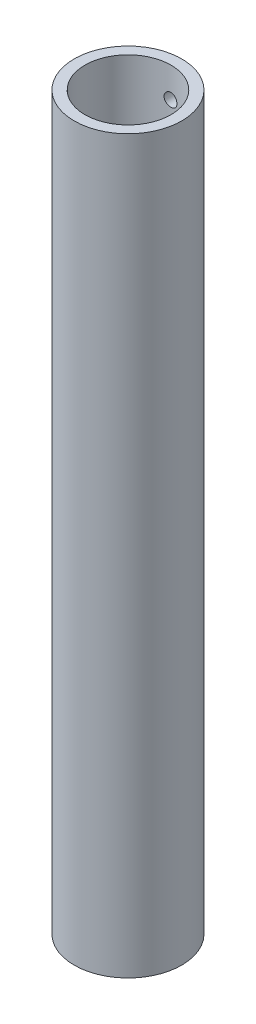
ISO-10303-21;
HEADER;
FILE_DESCRIPTION(('STEP AP214'),'2;1');
FILE_NAME('part.step','',(''),(''),'','','');
FILE_SCHEMA(('AUTOMOTIVE_DESIGN { 1 0 10303 214 1 1 1 1 }'));
ENDSEC;
DATA;
#1=APPLICATION_CONTEXT('core data for automotive mechanical design processes');
#2=APPLICATION_PROTOCOL_DEFINITION('international standard','automotive_design',2000,#1);
#3=PRODUCT_CONTEXT('',#1,'mechanical');
#4=PRODUCT('Part','Part','',(#3));
#5=PRODUCT_RELATED_PRODUCT_CATEGORY('part','',(#4));
#6=PRODUCT_DEFINITION_FORMATION('','',#4);
#7=PRODUCT_DEFINITION_CONTEXT('part definition',#1,'design');
#8=PRODUCT_DEFINITION('design','',#6,#7);
#9=PRODUCT_DEFINITION_SHAPE('','',#8);
#10=(LENGTH_UNIT() NAMED_UNIT(*) SI_UNIT(.MILLI.,.METRE.));
#11=(NAMED_UNIT(*) PLANE_ANGLE_UNIT() SI_UNIT($,.RADIAN.));
#12=(NAMED_UNIT(*) SI_UNIT($,.STERADIAN.) SOLID_ANGLE_UNIT());
#13=UNCERTAINTY_MEASURE_WITH_UNIT(LENGTH_MEASURE(1.E-05),#10,'distance_accuracy_value','');
#14=(GEOMETRIC_REPRESENTATION_CONTEXT(3) GLOBAL_UNCERTAINTY_ASSIGNED_CONTEXT((#13)) GLOBAL_UNIT_ASSIGNED_CONTEXT((#10,
#11,#12)) REPRESENTATION_CONTEXT('',''));
#15=CARTESIAN_POINT('',(0.,0.,0.));
#16=DIRECTION('',(0.,0.,1.));
#17=DIRECTION('',(1.,0.,0.));
#18=AXIS2_PLACEMENT_3D('',#15,#16,#17);
#19=CARTESIAN_POINT('',(0.,170.,0.));
#20=DIRECTION('',(0.,1.,0.));
#21=DIRECTION('',(0.,0.,1.));
#22=AXIS2_PLACEMENT_3D('',#19,#20,#21);
#23=PLANE('',#22);
#24=CARTESIAN_POINT('',(0.,170.,0.));
#25=DIRECTION('',(0.,1.,0.));
#26=DIRECTION('',(0.,0.,1.));
#27=AXIS2_PLACEMENT_3D('',#24,#25,#26);
#28=CIRCLE('',#27,12.5);
#29=CARTESIAN_POINT('',(0.,170.,12.5));
#30=VERTEX_POINT('',#29);
#31=EDGE_CURVE('E10',#30,#30,#28,.T.);
#32=ORIENTED_EDGE('',*,*,#31,.T.);
#33=EDGE_LOOP('',(#32));
#34=FACE_BOUND('',#33,.T.);
#35=CARTESIAN_POINT('',(0.,170.,0.));
#36=DIRECTION('',(0.,1.,0.));
#37=DIRECTION('',(0.,0.,1.));
#38=AXIS2_PLACEMENT_3D('',#35,#36,#37);
#39=CIRCLE('',#38,9.99999999999999);
#40=CARTESIAN_POINT('',(0.,170.,9.99999999999999));
#41=VERTEX_POINT('',#40);
#42=EDGE_CURVE('E57',#41,#41,#39,.T.);
#43=ORIENTED_EDGE('',*,*,#42,.F.);
#44=EDGE_LOOP('',(#43));
#45=FACE_BOUND('',#44,.T.);
#46=ADVANCED_FACE('F38',(#34,#45),#23,.T.);
#47=CARTESIAN_POINT('',(0.,0.,0.));
#48=DIRECTION('',(0.,1.,0.));
#49=DIRECTION('',(0.,0.,1.));
#50=AXIS2_PLACEMENT_3D('',#47,#48,#49);
#51=PLANE('',#50);
#52=CARTESIAN_POINT('',(0.,0.,0.));
#53=DIRECTION('',(0.,1.,0.));
#54=DIRECTION('',(0.,0.,1.));
#55=AXIS2_PLACEMENT_3D('',#52,#53,#54);
#56=CIRCLE('',#55,12.5);
#57=CARTESIAN_POINT('',(0.,0.,12.5));
#58=VERTEX_POINT('',#57);
#59=EDGE_CURVE('E52',#58,#58,#56,.T.);
#60=ORIENTED_EDGE('',*,*,#59,.F.);
#61=EDGE_LOOP('',(#60));
#62=FACE_BOUND('',#61,.T.);
#63=CARTESIAN_POINT('',(0.,0.,0.));
#64=DIRECTION('',(0.,1.,0.));
#65=DIRECTION('',(0.,0.,1.));
#66=AXIS2_PLACEMENT_3D('',#63,#64,#65);
#67=CIRCLE('',#66,9.99999999999999);
#68=CARTESIAN_POINT('',(0.,0.,9.99999999999999));
#69=VERTEX_POINT('',#68);
#70=EDGE_CURVE('E59',#69,#69,#67,.T.);
#71=ORIENTED_EDGE('',*,*,#70,.T.);
#72=EDGE_LOOP('',(#71));
#73=FACE_BOUND('',#72,.T.);
#74=ADVANCED_FACE('F80',(#62,#73),#51,.F.);
#75=CARTESIAN_POINT('',(0.,170.,0.));
#76=DIRECTION('',(0.,-1.,0.));
#77=DIRECTION('',(0.,0.,-1.));
#78=AXIS2_PLACEMENT_3D('',#75,#76,#77);
#79=CYLINDRICAL_SURFACE('',#78,12.5);
#80=CARTESIAN_POINT('',(0.,164.5,-12.5));
#81=CARTESIAN_POINT('',(-0.0839320235538492,164.499996418029,-12.499998867873));
#82=CARTESIAN_POINT('',(-0.167917158665595,164.492931670654,-12.4991457100204));
#83=CARTESIAN_POINT('',(-0.333552285654122,164.464859467922,-12.495824352711));
#84=CARTESIAN_POINT('',(-0.41519971479503,164.443837279375,-12.4933544466864));
#85=CARTESIAN_POINT('',(-0.573737397670255,164.388476861737,-12.4870779632713));
#86=CARTESIAN_POINT('',(-0.650630743796111,164.354147396588,-12.4832722657654));
#87=CARTESIAN_POINT('',(-0.79754957891599,164.273165632458,-12.4747479632173));
#88=CARTESIAN_POINT('',(-0.867576283567572,164.226515520123,-12.4700295202071));
#89=CARTESIAN_POINT('',(-0.999145657672247,164.121962569012,-12.460180052721));
#90=CARTESIAN_POINT('',(-1.06064834565359,164.064009579944,-12.4550472515452));
#91=CARTESIAN_POINT('',(-1.1730796551917,163.938603517556,-12.4449619698576));
#92=CARTESIAN_POINT('',(-1.22400774913236,163.871149970491,-12.4400094983534));
#93=CARTESIAN_POINT('',(-1.31399171436948,163.728399587351,-12.4308280185202));
#94=CARTESIAN_POINT('',(-1.35301037836285,163.65307913771,-12.4266012951986));
#95=CARTESIAN_POINT('',(-1.4178302865078,163.496895648946,-12.4193730672343));
#96=CARTESIAN_POINT('',(-1.44363199348388,163.416032804015,-12.4163715196899));
#97=CARTESIAN_POINT('',(-1.481164650227,163.251473570344,-12.4119503036869));
#98=CARTESIAN_POINT('',(-1.49296288993823,163.167792735786,-12.4105230726271));
#99=CARTESIAN_POINT('',(-1.50236187609835,162.999627531818,-12.4093888845306));
#100=CARTESIAN_POINT('',(-1.49996315026424,162.915143192392,-12.4096818635516));
#101=CARTESIAN_POINT('',(-1.48109158039334,162.748237017608,-12.4119480733153));
#102=CARTESIAN_POINT('',(-1.46469271611152,162.66580668066,-12.4139124717338));
#103=CARTESIAN_POINT('',(-1.41840173085034,162.504876486089,-12.4192864043804));
#104=CARTESIAN_POINT('',(-1.38850935612908,162.42637670241,-12.4226959657844));
#105=CARTESIAN_POINT('',(-1.31599990349931,162.27530526588,-12.4305861039738));
#106=CARTESIAN_POINT('',(-1.27335053101963,162.202749260823,-12.4350693931099));
#107=CARTESIAN_POINT('',(-1.17656086584735,162.065796394542,-12.444599699395));
#108=CARTESIAN_POINT('',(-1.12242008861579,162.001399877549,-12.4496467403106));
#109=CARTESIAN_POINT('',(-1.00377377781091,161.882164457818,-12.4597751654319));
#110=CARTESIAN_POINT('',(-0.939204450256097,161.827389015071,-12.464856563712));
#111=CARTESIAN_POINT('',(-0.801753979469379,161.7294442395,-12.4744510399275));
#112=CARTESIAN_POINT('',(-0.728872819540037,161.68627492999,-12.478964116721));
#113=CARTESIAN_POINT('',(-0.576819654131431,161.61276835718,-12.4869159430851));
#114=CARTESIAN_POINT('',(-0.497645789357803,161.582434903335,-12.4903543736405));
#115=CARTESIAN_POINT('',(-0.335278011136724,161.535510631075,-12.4957665326545));
#116=CARTESIAN_POINT('',(-0.252084271220814,161.518919219998,-12.4977403242792));
#117=CARTESIAN_POINT('',(-0.0845871981871095,161.500031872251,-12.4999926250152));
#118=CARTESIAN_POINT('',(-0.000293860216027687,161.4976484838,-12.5002815046876));
#119=CARTESIAN_POINT('',(0.167491034121627,161.507014288934,-12.4991593911616));
#120=CARTESIAN_POINT('',(0.25098260616366,161.518763205648,-12.4977484312654));
#121=CARTESIAN_POINT('',(0.414537131964172,161.555987482002,-12.4933916690343));
#122=CARTESIAN_POINT('',(0.494609673184511,161.581421306525,-12.4904505118954));
#123=CARTESIAN_POINT('',(0.649352698843224,161.645250351677,-12.4833627750896));
#124=CARTESIAN_POINT('',(0.724023012961732,161.683645980745,-12.4792161574379));
#125=CARTESIAN_POINT('',(0.866233588832516,161.772521457951,-12.4701542579347));
#126=CARTESIAN_POINT('',(0.933738144813748,161.823058068905,-12.4652354042322));
#127=CARTESIAN_POINT('',(1.05933812576101,161.934700423204,-12.455190895971));
#128=CARTESIAN_POINT('',(1.11743320736474,161.995806552074,-12.4500652338742));
#129=CARTESIAN_POINT('',(1.22287397613076,162.127237807714,-12.4401529742471));
#130=CARTESIAN_POINT('',(1.27016181615969,162.197609507672,-12.4353682915654));
#131=CARTESIAN_POINT('',(1.35224657214666,162.345347512538,-12.4267107496692));
#132=CARTESIAN_POINT('',(1.38704372178037,162.422713686559,-12.4228378733971));
#133=CARTESIAN_POINT('',(1.4430649833408,162.582055304447,-12.4164552867251));
#134=CARTESIAN_POINT('',(1.46432210079673,162.66401900593,-12.4139422637816));
#135=CARTESIAN_POINT('',(1.49276636081758,162.830384484743,-12.4105542637293));
#136=CARTESIAN_POINT('',(1.49995410263041,162.914786158079,-12.4096792168553));
#137=CARTESIAN_POINT('',(1.50004516908966,163.083056364819,-12.4096681633035));
#138=CARTESIAN_POINT('',(1.49303936835676,163.166924862886,-12.4105210931972));
#139=CARTESIAN_POINT('',(1.46513424336045,163.332283393197,-12.4138461473713));
#140=CARTESIAN_POINT('',(1.44423491411034,163.413773424588,-12.4163182722328));
#141=CARTESIAN_POINT('',(1.38916369910273,163.572052269444,-12.4225998262293));
#142=CARTESIAN_POINT('',(1.35499582785269,163.648842496748,-12.4264088508406));
#143=CARTESIAN_POINT('',(1.27436641314005,163.795613873535,-12.4349357269569));
#144=CARTESIAN_POINT('',(1.22790476354723,163.86559496423,-12.4396535863076));
#145=CARTESIAN_POINT('',(1.12366844823603,163.997226470054,-12.4495027561294));
#146=CARTESIAN_POINT('',(1.06582601965076,164.058823051633,-12.4546364290673));
#147=CARTESIAN_POINT('',(0.940610466672243,164.171471239783,-12.4647177484085));
#148=CARTESIAN_POINT('',(0.87323509131801,164.222520348815,-12.4696653505255));
#149=CARTESIAN_POINT('',(0.730596612325688,164.312775288999,-12.4788360854662));
#150=CARTESIAN_POINT('',(0.655306617312091,164.351938862861,-12.4830566108105));
#151=CARTESIAN_POINT('',(0.499211375842659,164.417011882221,-12.4902709259863));
#152=CARTESIAN_POINT('',(0.418412282181075,164.44293584809,-12.4932660590308));
#153=CARTESIAN_POINT('',(0.280988550618351,164.474531710169,-12.4969634163));
#154=CARTESIAN_POINT('',(0.225233284876746,164.484068741943,-12.4980966397165));
#155=CARTESIAN_POINT('',(0.112993367846849,164.496804071745,-12.4996153102102));
#156=CARTESIAN_POINT('',(0.0565087213768136,164.500002411625,-12.5000007622246));
#157=CARTESIAN_POINT('',(0.,164.5,-12.5));
#158=B_SPLINE_CURVE_WITH_KNOTS('',3,(#80,#81,#82,#83,#84,#85,#86,#87,#88,#89,#90,#91,#92,#93,
#94,#95,#96,#97,#98,#99,#100,#101,#102,#103,#104,#105,#106,#107,#108,#109,#110,#111,#112,#113,
#114,#115,#116,#117,#118,#119,#120,#121,#122,#123,#124,#125,#126,#127,#128,#129,#130,#131,#132,
#133,#134,#135,#136,#137,#138,#139,#140,#141,#142,#143,#144,#145,#146,#147,#148,#149,#150,#151,
#152,#153,#154,#155,#156,#157),.UNSPECIFIED.,.T.,.F.,(4,2,2,2,2,2,2,2,2,2,2,2,2,2,2,2,2,2,2,2,2,
2,2,2,2,2,2,2,2,2,2,2,2,2,2,2,2,2,4),(0.,0.251589675478076,0.503445347043116,0.755135431877781,
1.00678087720846,1.25956936097938,1.51237045452441,1.765953447482,2.01952755999557,
2.27187819171636,2.52421944334237,2.77523546456125,3.02625620626699,3.27791786855267,
3.52959014434629,3.78286472320156,4.036139810863,4.28949001347139,4.5428292891131,
4.79460761312113,5.04638100450539,5.29739451278873,5.54841593150835,5.8006346089278,
6.05286248801782,6.30641037908359,6.55995352653148,6.81287624132442,7.06578818330769,
7.31708596596143,7.56838383881168,7.81960573856941,8.07082980715607,8.32359762010158,
8.57642521760044,8.83014145119728,9.08357882396373,9.25296714728133,9.42235435219904),.UNSPECIFIED.);
#159=CARTESIAN_POINT('',(0.,164.5,-12.5));
#160=VERTEX_POINT('',#159);
#161=EDGE_CURVE('E62',#160,#160,#158,.T.);
#162=ORIENTED_EDGE('',*,*,#161,.T.);
#163=EDGE_LOOP('',(#162));
#164=FACE_BOUND('',#163,.T.);
#165=ORIENTED_EDGE('',*,*,#31,.F.);
#166=EDGE_LOOP('',(#165));
#167=FACE_BOUND('',#166,.T.);
#168=ORIENTED_EDGE('',*,*,#59,.T.);
#169=EDGE_LOOP('',(#168));
#170=FACE_BOUND('',#169,.T.);
#171=ADVANCED_FACE('F40',(#164,#167,#170),#79,.T.);
#172=CARTESIAN_POINT('',(0.,170.,0.));
#173=DIRECTION('',(0.,-1.,0.));
#174=DIRECTION('',(0.,0.,-1.));
#175=AXIS2_PLACEMENT_3D('',#172,#173,#174);
#176=CYLINDRICAL_SURFACE('',#175,9.99999999999999);
#177=CARTESIAN_POINT('',(0.,164.5,-9.99999999999999));
#178=CARTESIAN_POINT('',(-0.0837515444816415,164.499996546185,-9.99999865771296));
#179=CARTESIAN_POINT('',(-0.16755168508213,164.492961999159,-9.99893682537039));
#180=CARTESIAN_POINT('',(-0.33280962799491,164.465016800017,-9.99480315973186));
#181=CARTESIAN_POINT('',(-0.414265068974225,164.444092637055,-9.99172936938472));
#182=CARTESIAN_POINT('',(-0.572418086221851,164.389007495032,-9.98391721219525));
#183=CARTESIAN_POINT('',(-0.649119207826785,164.354856520494,-9.97918010370919));
#184=CARTESIAN_POINT('',(-0.795690428635238,164.274311620583,-9.96856475911723));
#185=CARTESIAN_POINT('',(-0.865561474725172,164.227919395583,-9.96268668152772));
#186=CARTESIAN_POINT('',(-0.997046719562113,164.12382273506,-9.95039170991452));
#187=CARTESIAN_POINT('',(-1.05859983222549,164.066041543792,-9.94397133890331));
#188=CARTESIAN_POINT('',(-1.17117490668948,163.940972311106,-9.93134261133238));
#189=CARTESIAN_POINT('',(-1.22219626272935,163.873683723221,-9.92513426698504));
#190=CARTESIAN_POINT('',(-1.31249729499942,163.731099356478,-9.91359877458725));
#191=CARTESIAN_POINT('',(-1.35171787037205,163.655765753019,-9.9082761197503));
#192=CARTESIAN_POINT('',(-1.41692632171056,163.499487179355,-9.89916211306267));
#193=CARTESIAN_POINT('',(-1.44291491889163,163.418542515256,-9.89537067775448));
#194=CARTESIAN_POINT('',(-1.48073198798911,163.253981958128,-9.88978256218673));
#195=CARTESIAN_POINT('',(-1.49266503640518,163.170390606592,-9.8879711574125));
#196=CARTESIAN_POINT('',(-1.50235624033932,163.002373834013,-9.88650348970581));
#197=CARTESIAN_POINT('',(-1.50011520973796,162.917948461138,-9.88684710303146));
#198=CARTESIAN_POINT('',(-1.48160733250788,162.751398919806,-9.88963718352409));
#199=CARTESIAN_POINT('',(-1.46545695927751,162.669261473515,-9.89206618761549));
#200=CARTESIAN_POINT('',(-1.41977117403735,162.508875631128,-9.89872608126367));
#201=CARTESIAN_POINT('',(-1.39023538337813,162.430627345119,-9.90295702179379));
#202=CARTESIAN_POINT('',(-1.31849603529736,162.279886628717,-9.9127633554548));
#203=CARTESIAN_POINT('',(-1.27624314283197,162.207418030908,-9.91834396766526));
#204=CARTESIAN_POINT('',(-1.18030413128954,162.070555404218,-9.93021707574547));
#205=CARTESIAN_POINT('',(-1.12661726182478,162.006161905731,-9.936509618325));
#206=CARTESIAN_POINT('',(-1.00869493078248,161.88660233926,-9.94917473056209));
#207=CARTESIAN_POINT('',(-0.944359329641992,161.831535009714,-9.95554747112814));
#208=CARTESIAN_POINT('',(-0.80730708989417,161.732964065493,-9.96759647648461));
#209=CARTESIAN_POINT('',(-0.734590414588157,161.689460501456,-9.9732727382251));
#210=CARTESIAN_POINT('',(-0.582754598213678,161.6152469135,-9.98329515585392));
#211=CARTESIAN_POINT('',(-0.503631677836775,161.58454450816,-9.98764051925427));
#212=CARTESIAN_POINT('',(-0.341273182487061,161.536890610315,-9.99450490557069));
#213=CARTESIAN_POINT('',(-0.258037885952605,161.519938188184,-9.99702405195467));
#214=CARTESIAN_POINT('',(-0.090669567643655,161.500396770183,-9.99993581133871));
#215=CARTESIAN_POINT('',(-0.00655273187047949,161.497672028621,-10.0003485209039));
#216=CARTESIAN_POINT('',(0.160936677662272,161.506303005311,-9.99905561015226));
#217=CARTESIAN_POINT('',(0.244309274381865,161.517658287668,-9.99735005541368));
#218=CARTESIAN_POINT('',(0.4075323874314,161.554014100178,-9.99202468615333));
#219=CARTESIAN_POINT('',(0.487397963079835,161.578948496031,-9.98841415207984));
#220=CARTESIAN_POINT('',(0.641814958642997,161.641684997462,-9.97968235658369));
#221=CARTESIAN_POINT('',(0.716366128795094,161.679487707334,-9.97456102421565));
#222=CARTESIAN_POINT('',(0.858634979291911,161.767206224564,-9.96332682468686));
#223=CARTESIAN_POINT('',(0.926299009891555,161.817208140013,-9.95720701626745));
#224=CARTESIAN_POINT('',(1.0523236731777,161.927785811629,-9.94467863012164));
#225=CARTESIAN_POINT('',(1.11068376479339,161.988362182325,-9.93827003562867));
#226=CARTESIAN_POINT('',(1.21693784957195,162.118973533176,-9.92582264304493));
#227=CARTESIAN_POINT('',(1.26474084747421,162.189082925195,-9.91978736017588));
#228=CARTESIAN_POINT('',(1.34789129270584,162.336416040512,-9.90883219104903));
#229=CARTESIAN_POINT('',(1.38323907656435,162.413639571521,-9.90391227465628));
#230=CARTESIAN_POINT('',(1.44033467323943,162.572737533623,-9.89577033008644));
#231=CARTESIAN_POINT('',(1.46213037141636,162.654594460971,-9.89254233006438));
#232=CARTESIAN_POINT('',(1.49165549501587,162.820859015435,-9.88813382297802));
#233=CARTESIAN_POINT('',(1.49938589183067,162.905266465995,-9.8869531745177));
#234=CARTESIAN_POINT('',(1.5005378666944,163.073329063316,-9.88677832610841));
#235=CARTESIAN_POINT('',(1.49410252167313,163.156983241757,-9.88776226333501));
#236=CARTESIAN_POINT('',(1.46741229544379,163.322005263324,-9.89175820611173));
#237=CARTESIAN_POINT('',(1.44715743638627,163.403373110113,-9.89477020841117));
#238=CARTESIAN_POINT('',(1.39345373518665,163.561473082234,-9.90247526112296));
#239=CARTESIAN_POINT('',(1.36001489324314,163.638208670433,-9.90716703716075));
#240=CARTESIAN_POINT('',(1.28090667642309,163.785003633802,-9.91770454557701));
#241=CARTESIAN_POINT('',(1.23523688741501,163.855062782804,-9.92355031702723));
#242=CARTESIAN_POINT('',(1.13244337659163,163.987243057975,-9.93580743364937));
#243=CARTESIAN_POINT('',(1.07521369039804,164.049281333247,-9.94222367881967));
#244=CARTESIAN_POINT('',(0.951148841082818,164.162924554788,-9.95485788826636));
#245=CARTESIAN_POINT('',(0.884311448350935,164.214527072576,-9.96107580610758));
#246=CARTESIAN_POINT('',(0.742495707543723,164.306087676607,-9.9726518579052));
#247=CARTESIAN_POINT('',(0.667474576764758,164.345980109215,-9.9780050712882));
#248=CARTESIAN_POINT('',(0.511751870248719,164.412538516758,-9.98720028802959));
#249=CARTESIAN_POINT('',(0.431056277096711,164.439218190054,-9.99104385565756));
#250=CARTESIAN_POINT('',(0.291665727889341,164.47254134271,-9.99590939261505));
#251=CARTESIAN_POINT('',(0.233831133495288,164.482822601539,-9.99743549179556));
#252=CARTESIAN_POINT('',(0.117338971600131,164.496553097713,-9.99948125947895));
#253=CARTESIAN_POINT('',(0.05868141433442,164.500002419953,-10.0000009404877));
#254=CARTESIAN_POINT('',(0.,164.5,-9.99999999999999));
#255=B_SPLINE_CURVE_WITH_KNOTS('',3,(#177,#178,#179,#180,#181,#182,#183,#184,#185,#186,#187,
#188,#189,#190,#191,#192,#193,#194,#195,#196,#197,#198,#199,#200,#201,#202,#203,#204,#205,#206,
#207,#208,#209,#210,#211,#212,#213,#214,#215,#216,#217,#218,#219,#220,#221,#222,#223,#224,#225,
#226,#227,#228,#229,#230,#231,#232,#233,#234,#235,#236,#237,#238,#239,#240,#241,#242,#243,#244,
#245,#246,#247,#248,#249,#250,#251,#252,#253,#254),.UNSPECIFIED.,.T.,.F.,(4,2,2,2,2,2,2,2,2,2,2,
2,2,2,2,2,2,2,2,2,2,2,2,2,2,2,2,2,2,2,2,2,2,2,2,2,2,2,4),(0.,0.251040205031659,
0.502324962929147,0.753420023583214,1.00448022419759,1.25729416136843,1.51012263572579,
1.76419702395375,2.01825756225506,2.27041564605924,2.52255925098982,2.77261177195746,
3.02267136690361,3.27371383476162,3.52477278308535,3.77834291255411,4.0319141523867,
4.28563608984876,4.53934087193401,4.79062058544255,5.04189251991155,5.29195148965949,
5.54202220376274,5.79391188036908,6.04581620028628,6.29981366584672,6.55380426808833,
6.80689223457169,7.05996272137178,7.31048888261064,7.56101464229563,7.81135073984148,
8.06169531466881,8.31444829965723,8.56726003468734,8.82146323384733,9.0754023326144,
9.25129851978808,9.42719252123291),.UNSPECIFIED.);
#256=CARTESIAN_POINT('',(0.,164.5,-9.99999999999999));
#257=VERTEX_POINT('',#256);
#258=EDGE_CURVE('E43',#257,#257,#255,.T.);
#259=ORIENTED_EDGE('',*,*,#258,.F.);
#260=EDGE_LOOP('',(#259));
#261=FACE_BOUND('',#260,.T.);
#262=ORIENTED_EDGE('',*,*,#42,.T.);
#263=EDGE_LOOP('',(#262));
#264=FACE_BOUND('',#263,.T.);
#265=ORIENTED_EDGE('',*,*,#70,.F.);
#266=EDGE_LOOP('',(#265));
#267=FACE_BOUND('',#266,.T.);
#268=ADVANCED_FACE('F72',(#261,#264,#267),#176,.F.);
#269=CARTESIAN_POINT('',(0.,163.,-2.5));
#270=DIRECTION('',(0.,0.,-1.));
#271=DIRECTION('',(-1.,0.,0.));
#272=AXIS2_PLACEMENT_3D('',#269,#270,#271);
#273=CYLINDRICAL_SURFACE('',#272,1.5);
#274=ORIENTED_EDGE('',*,*,#258,.T.);
#275=EDGE_LOOP('',(#274));
#276=FACE_BOUND('',#275,.T.);
#277=ORIENTED_EDGE('',*,*,#161,.F.);
#278=EDGE_LOOP('',(#277));
#279=FACE_BOUND('',#278,.T.);
#280=ADVANCED_FACE('F69',(#276,#279),#273,.F.);
#281=CLOSED_SHELL('',(#46,#74,#171,#268,#280));
#282=MANIFOLD_SOLID_BREP('B2',#281);
#283=ADVANCED_BREP_SHAPE_REPRESENTATION('',(#18,#282),#14);
#284=SHAPE_DEFINITION_REPRESENTATION(#9,#283);
ENDSEC;
END-ISO-10303-21;
